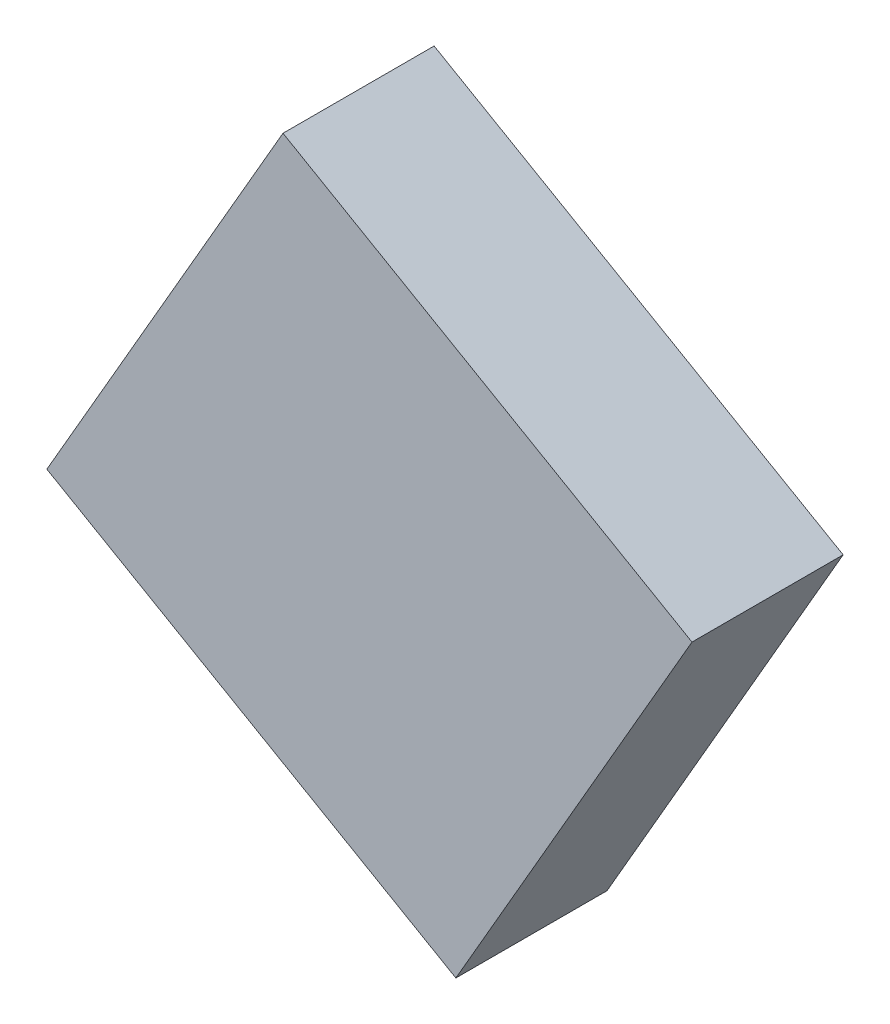
ISO-10303-21;
HEADER;
FILE_DESCRIPTION(('STEP AP214'),'2;1');
FILE_NAME('part.step','',(''),(''),'','','');
FILE_SCHEMA(('AUTOMOTIVE_DESIGN { 1 0 10303 214 1 1 1 1 }'));
ENDSEC;
DATA;
#1=APPLICATION_CONTEXT('core data for automotive mechanical design processes');
#2=APPLICATION_PROTOCOL_DEFINITION('international standard','automotive_design',2000,#1);
#3=PRODUCT_CONTEXT('',#1,'mechanical');
#4=PRODUCT('Part','Part','',(#3));
#5=PRODUCT_RELATED_PRODUCT_CATEGORY('part','',(#4));
#6=PRODUCT_DEFINITION_FORMATION('','',#4);
#7=PRODUCT_DEFINITION_CONTEXT('part definition',#1,'design');
#8=PRODUCT_DEFINITION('design','',#6,#7);
#9=PRODUCT_DEFINITION_SHAPE('','',#8);
#10=(LENGTH_UNIT() NAMED_UNIT(*) SI_UNIT(.MILLI.,.METRE.));
#11=(NAMED_UNIT(*) PLANE_ANGLE_UNIT() SI_UNIT($,.RADIAN.));
#12=(NAMED_UNIT(*) SI_UNIT($,.STERADIAN.) SOLID_ANGLE_UNIT());
#13=UNCERTAINTY_MEASURE_WITH_UNIT(LENGTH_MEASURE(1.E-05),#10,'distance_accuracy_value','');
#14=(GEOMETRIC_REPRESENTATION_CONTEXT(3) GLOBAL_UNCERTAINTY_ASSIGNED_CONTEXT((#13)) GLOBAL_UNIT_ASSIGNED_CONTEXT((#10,
#11,#12)) REPRESENTATION_CONTEXT('',''));
#15=CARTESIAN_POINT('',(0.,0.,0.));
#16=DIRECTION('',(0.,0.,1.));
#17=DIRECTION('',(1.,0.,0.));
#18=AXIS2_PLACEMENT_3D('',#15,#16,#17);
#19=CARTESIAN_POINT('',(-3.41506302,-0.91506294,1.59999934));
#20=DIRECTION('',(0.,0.,1.));
#21=DIRECTION('',(1.,0.,0.));
#22=AXIS2_PLACEMENT_3D('',#19,#20,#21);
#23=PLANE('',#22);
#24=DIRECTION('',(-0.866025343910241,0.500000103705139,0.));
#25=VECTOR('',#24,1.);
#26=CARTESIAN_POINT('',(-0.91506294,3.41506302,1.59999934));
#27=LINE('',#26,#25);
#28=CARTESIAN_POINT('',(-0.915062940000285,3.41506302000016,1.59999934));
#29=VERTEX_POINT('',#28);
#30=CARTESIAN_POINT('',(3.41506302000016,0.915062940000285,1.59999934));
#31=VERTEX_POINT('',#30);
#32=EDGE_CURVE('E53',#29,#31,#27,.F.);
#33=ORIENTED_EDGE('',*,*,#32,.F.);
#34=DIRECTION('',(-0.500000103705139,-0.866025343910241,0.));
#35=VECTOR('',#34,1.);
#36=CARTESIAN_POINT('',(-3.41506302,-0.91506294,1.59999934));
#37=LINE('',#36,#35);
#38=CARTESIAN_POINT('',(-3.41506302000033,-0.915062940000569,1.59999934));
#39=VERTEX_POINT('',#38);
#40=EDGE_CURVE('E68',#39,#29,#37,.F.);
#41=ORIENTED_EDGE('',*,*,#40,.F.);
#42=DIRECTION('',(0.866025343910241,-0.500000103705139,0.));
#43=VECTOR('',#42,1.);
#44=CARTESIAN_POINT('',(0.91506294,-3.41506302,1.59999934));
#45=LINE('',#44,#43);
#46=CARTESIAN_POINT('',(0.915062940000285,-3.41506302000016,1.59999934));
#47=VERTEX_POINT('',#46);
#48=EDGE_CURVE('E20',#47,#39,#45,.F.);
#49=ORIENTED_EDGE('',*,*,#48,.F.);
#50=DIRECTION('',(0.500000103705139,0.866025343910241,0.));
#51=VECTOR('',#50,1.);
#52=CARTESIAN_POINT('',(3.41506302,0.91506294,1.59999934));
#53=LINE('',#52,#51);
#54=EDGE_CURVE('E58',#31,#47,#53,.F.);
#55=ORIENTED_EDGE('',*,*,#54,.F.);
#56=EDGE_LOOP('',(#33,#41,#49,#55));
#57=FACE_BOUND('',#56,.T.);
#58=ADVANCED_FACE('F17',(#57),#23,.T.);
#59=CARTESIAN_POINT('',(0.91506294,-3.41506302,0.));
#60=DIRECTION('',(-0.500000103705139,-0.866025343910241,0.));
#61=DIRECTION('',(0.866025343910241,-0.500000103705139,0.));
#62=AXIS2_PLACEMENT_3D('',#59,#60,#61);
#63=PLANE('',#62);
#64=DIRECTION('',(0.,0.,1.));
#65=VECTOR('',#64,1.);
#66=CARTESIAN_POINT('',(-3.41506302,-0.91506294,0.));
#67=LINE('',#66,#65);
#68=CARTESIAN_POINT('',(-3.41506302000033,-0.915062940000569,0.));
#69=VERTEX_POINT('',#68);
#70=EDGE_CURVE('E79',#69,#39,#67,.T.);
#71=ORIENTED_EDGE('',*,*,#70,.F.);
#72=DIRECTION('',(0.866025343910109,-0.500000103705367,0.));
#73=VECTOR('',#72,1.);
#74=CARTESIAN_POINT('',(-3.41506302,-0.91506294,0.));
#75=LINE('',#74,#73);
#76=CARTESIAN_POINT('',(0.915062940000285,-3.41506302000016,0.));
#77=VERTEX_POINT('',#76);
#78=EDGE_CURVE('E74',#69,#77,#75,.T.);
#79=ORIENTED_EDGE('',*,*,#78,.T.);
#80=DIRECTION('',(0.,0.,1.));
#81=VECTOR('',#80,1.);
#82=CARTESIAN_POINT('',(0.915062940001138,-3.41506302000065,0.));
#83=LINE('',#82,#81);
#84=EDGE_CURVE('E63',#47,#77,#83,.F.);
#85=ORIENTED_EDGE('',*,*,#84,.F.);
#86=ORIENTED_EDGE('',*,*,#48,.T.);
#87=EDGE_LOOP('',(#71,#79,#85,#86));
#88=FACE_BOUND('',#87,.T.);
#89=ADVANCED_FACE('F73',(#88),#63,.T.);
#90=CARTESIAN_POINT('',(3.41506302,0.91506294,0.));
#91=DIRECTION('',(0.866025343910241,-0.500000103705139,0.));
#92=DIRECTION('',(0.500000103705139,0.866025343910241,0.));
#93=AXIS2_PLACEMENT_3D('',#90,#91,#92);
#94=PLANE('',#93);
#95=ORIENTED_EDGE('',*,*,#84,.T.);
#96=DIRECTION('',(0.500000103705367,0.866025343910109,0.));
#97=VECTOR('',#96,1.);
#98=CARTESIAN_POINT('',(0.91506294,-3.41506302,0.));
#99=LINE('',#98,#97);
#100=CARTESIAN_POINT('',(3.41506302000016,0.915062940000285,0.));
#101=VERTEX_POINT('',#100);
#102=EDGE_CURVE('E84',#77,#101,#99,.T.);
#103=ORIENTED_EDGE('',*,*,#102,.T.);
#104=DIRECTION('',(0.,0.,1.));
#105=VECTOR('',#104,1.);
#106=CARTESIAN_POINT('',(3.41506302000065,0.915062940001138,0.));
#107=LINE('',#106,#105);
#108=EDGE_CURVE('E65',#31,#101,#107,.F.);
#109=ORIENTED_EDGE('',*,*,#108,.F.);
#110=ORIENTED_EDGE('',*,*,#54,.T.);
#111=EDGE_LOOP('',(#95,#103,#109,#110));
#112=FACE_BOUND('',#111,.T.);
#113=ADVANCED_FACE('F60',(#112),#94,.T.);
#114=CARTESIAN_POINT('',(-0.91506294,3.41506302,0.));
#115=DIRECTION('',(0.500000103705139,0.866025343910241,0.));
#116=DIRECTION('',(-0.866025343910241,0.500000103705139,0.));
#117=AXIS2_PLACEMENT_3D('',#114,#115,#116);
#118=PLANE('',#117);
#119=ORIENTED_EDGE('',*,*,#108,.T.);
#120=DIRECTION('',(-0.866025343910109,0.500000103705367,0.));
#121=VECTOR('',#120,1.);
#122=CARTESIAN_POINT('',(3.41506302,0.91506294,0.));
#123=LINE('',#122,#121);
#124=CARTESIAN_POINT('',(-0.915062940000285,3.41506302000016,0.));
#125=VERTEX_POINT('',#124);
#126=EDGE_CURVE('E26',#101,#125,#123,.T.);
#127=ORIENTED_EDGE('',*,*,#126,.T.);
#128=DIRECTION('',(0.,0.,1.));
#129=VECTOR('',#128,1.);
#130=CARTESIAN_POINT('',(-0.915062940001138,3.41506302000065,0.));
#131=LINE('',#130,#129);
#132=EDGE_CURVE('E34',#29,#125,#131,.F.);
#133=ORIENTED_EDGE('',*,*,#132,.F.);
#134=ORIENTED_EDGE('',*,*,#32,.T.);
#135=EDGE_LOOP('',(#119,#127,#133,#134));
#136=FACE_BOUND('',#135,.T.);
#137=ADVANCED_FACE('F88',(#136),#118,.T.);
#138=CARTESIAN_POINT('',(-3.41506302,-0.91506294,0.));
#139=DIRECTION('',(-0.866025343910241,0.500000103705139,0.));
#140=DIRECTION('',(-0.500000103705139,-0.866025343910241,0.));
#141=AXIS2_PLACEMENT_3D('',#138,#139,#140);
#142=PLANE('',#141);
#143=ORIENTED_EDGE('',*,*,#132,.T.);
#144=DIRECTION('',(-0.500000103705367,-0.866025343910109,0.));
#145=VECTOR('',#144,1.);
#146=CARTESIAN_POINT('',(-0.91506294,3.41506302,0.));
#147=LINE('',#146,#145);
#148=EDGE_CURVE('E11',#125,#69,#147,.T.);
#149=ORIENTED_EDGE('',*,*,#148,.T.);
#150=ORIENTED_EDGE('',*,*,#70,.T.);
#151=ORIENTED_EDGE('',*,*,#40,.T.);
#152=EDGE_LOOP('',(#143,#149,#150,#151));
#153=FACE_BOUND('',#152,.T.);
#154=ADVANCED_FACE('F91',(#153),#142,.T.);
#155=CARTESIAN_POINT('',(-3.41506302,-0.91506294,0.));
#156=DIRECTION('',(0.,0.,1.));
#157=DIRECTION('',(1.,0.,0.));
#158=AXIS2_PLACEMENT_3D('',#155,#156,#157);
#159=PLANE('',#158);
#160=ORIENTED_EDGE('',*,*,#126,.F.);
#161=ORIENTED_EDGE('',*,*,#102,.F.);
#162=ORIENTED_EDGE('',*,*,#78,.F.);
#163=ORIENTED_EDGE('',*,*,#148,.F.);
#164=EDGE_LOOP('',(#160,#161,#162,#163));
#165=FACE_BOUND('',#164,.T.);
#166=ADVANCED_FACE('F90',(#165),#159,.F.);
#167=CLOSED_SHELL('',(#58,#89,#113,#137,#154,#166));
#168=MANIFOLD_SOLID_BREP('B1',#167);
#169=ADVANCED_BREP_SHAPE_REPRESENTATION('',(#18,#168),#14);
#170=SHAPE_DEFINITION_REPRESENTATION(#9,#169);
ENDSEC;
END-ISO-10303-21;
